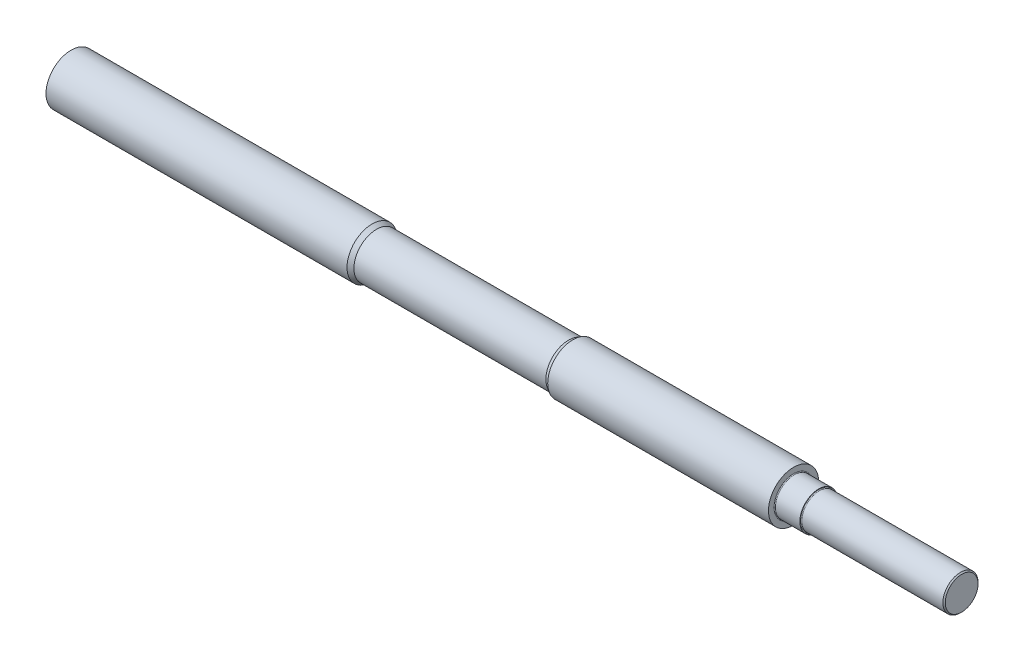
ISO-10303-21;
HEADER;
FILE_DESCRIPTION(('STEP AP214'),'2;1');
FILE_NAME('part.step','',(''),(''),'','','');
FILE_SCHEMA(('AUTOMOTIVE_DESIGN { 1 0 10303 214 1 1 1 1 }'));
ENDSEC;
DATA;
#1=APPLICATION_CONTEXT('core data for automotive mechanical design processes');
#2=APPLICATION_PROTOCOL_DEFINITION('international standard','automotive_design',2000,#1);
#3=PRODUCT_CONTEXT('',#1,'mechanical');
#4=PRODUCT('Part','Part','',(#3));
#5=PRODUCT_RELATED_PRODUCT_CATEGORY('part','',(#4));
#6=PRODUCT_DEFINITION_FORMATION('','',#4);
#7=PRODUCT_DEFINITION_CONTEXT('part definition',#1,'design');
#8=PRODUCT_DEFINITION('design','',#6,#7);
#9=PRODUCT_DEFINITION_SHAPE('','',#8);
#10=(LENGTH_UNIT() NAMED_UNIT(*) SI_UNIT(.MILLI.,.METRE.));
#11=(NAMED_UNIT(*) PLANE_ANGLE_UNIT() SI_UNIT($,.RADIAN.));
#12=(NAMED_UNIT(*) SI_UNIT($,.STERADIAN.) SOLID_ANGLE_UNIT());
#13=UNCERTAINTY_MEASURE_WITH_UNIT(LENGTH_MEASURE(1.E-05),#10,'distance_accuracy_value','');
#14=(GEOMETRIC_REPRESENTATION_CONTEXT(3) GLOBAL_UNCERTAINTY_ASSIGNED_CONTEXT((#13)) GLOBAL_UNIT_ASSIGNED_CONTEXT((#10,
#11,#12)) REPRESENTATION_CONTEXT('',''));
#15=CARTESIAN_POINT('',(0.,0.,0.));
#16=DIRECTION('',(0.,0.,1.));
#17=DIRECTION('',(1.,0.,0.));
#18=AXIS2_PLACEMENT_3D('',#15,#16,#17);
#19=CARTESIAN_POINT('',(0.,0.,0.));
#20=DIRECTION('',(1.,0.,0.));
#21=DIRECTION('',(0.,0.,-1.));
#22=AXIS2_PLACEMENT_3D('',#19,#20,#21);
#23=PLANE('',#22);
#24=CARTESIAN_POINT('',(0.,0.,0.));
#25=DIRECTION('',(-1.,0.,0.));
#26=DIRECTION('',(0.,0.,1.));
#27=AXIS2_PLACEMENT_3D('',#24,#25,#26);
#28=CIRCLE('',#27,10.);
#29=CARTESIAN_POINT('',(0.,0.,10.));
#30=VERTEX_POINT('',#29);
#31=EDGE_CURVE('E126',#30,#30,#28,.T.);
#32=ORIENTED_EDGE('',*,*,#31,.T.);
#33=EDGE_LOOP('',(#32));
#34=FACE_BOUND('',#33,.T.);
#35=CARTESIAN_POINT('',(0.,0.,0.));
#36=DIRECTION('',(-1.,0.,0.));
#37=DIRECTION('',(0.,0.,1.));
#38=AXIS2_PLACEMENT_3D('',#35,#36,#37);
#39=CIRCLE('',#38,5.);
#40=CARTESIAN_POINT('',(0.,0.,5.));
#41=VERTEX_POINT('',#40);
#42=EDGE_CURVE('E144',#41,#41,#39,.T.);
#43=ORIENTED_EDGE('',*,*,#42,.F.);
#44=EDGE_LOOP('',(#43));
#45=FACE_BOUND('',#44,.T.);
#46=ADVANCED_FACE('F44',(#34,#45),#23,.F.);
#47=CARTESIAN_POINT('',(355.,6.53333333333333,0.));
#48=DIRECTION('',(-1.,0.,0.));
#49=DIRECTION('',(0.,0.,1.));
#50=AXIS2_PLACEMENT_3D('',#47,#48,#49);
#51=PLANE('',#50);
#52=CARTESIAN_POINT('',(355.,0.,0.));
#53=DIRECTION('',(-1.,0.,0.));
#54=DIRECTION('',(0.,0.,1.));
#55=AXIS2_PLACEMENT_3D('',#52,#53,#54);
#56=CIRCLE('',#55,6.53333333333333);
#57=CARTESIAN_POINT('',(355.,0.,6.53333333333333));
#58=VERTEX_POINT('',#57);
#59=EDGE_CURVE('E11',#58,#58,#56,.T.);
#60=ORIENTED_EDGE('',*,*,#59,.F.);
#61=EDGE_LOOP('',(#60));
#62=FACE_BOUND('',#61,.T.);
#63=ADVANCED_FACE('F50',(#62),#51,.F.);
#64=CARTESIAN_POINT('',(355.,0.,0.));
#65=DIRECTION('',(-1.,0.,0.));
#66=DIRECTION('',(0.,0.,1.));
#67=AXIS2_PLACEMENT_3D('',#64,#65,#66);
#68=CONICAL_SURFACE('',#67,6.53333333333333,0.785398163397503);
#69=CARTESIAN_POINT('',(354.533333333333,0.,0.));
#70=DIRECTION('',(-1.,0.,0.));
#71=DIRECTION('',(0.,0.,1.));
#72=AXIS2_PLACEMENT_3D('',#69,#70,#71);
#73=CIRCLE('',#72,7.);
#74=CARTESIAN_POINT('',(354.533333333333,0.,7.));
#75=VERTEX_POINT('',#74);
#76=EDGE_CURVE('E55',#75,#75,#73,.T.);
#77=ORIENTED_EDGE('',*,*,#76,.F.);
#78=EDGE_LOOP('',(#77));
#79=FACE_BOUND('',#78,.T.);
#80=ORIENTED_EDGE('',*,*,#59,.T.);
#81=EDGE_LOOP('',(#80));
#82=FACE_BOUND('',#81,.T.);
#83=ADVANCED_FACE('F73',(#79,#82),#68,.T.);
#84=CARTESIAN_POINT('',(355.,0.,0.));
#85=DIRECTION('',(-1.,0.,0.));
#86=DIRECTION('',(0.,0.,1.));
#87=AXIS2_PLACEMENT_3D('',#84,#85,#86);
#88=CYLINDRICAL_SURFACE('',#87,6.99999999999999);
#89=CARTESIAN_POINT('',(298.3,0.,0.));
#90=DIRECTION('',(-1.,0.,0.));
#91=DIRECTION('',(0.,0.,1.));
#92=AXIS2_PLACEMENT_3D('',#89,#90,#91);
#93=CIRCLE('',#92,6.99999999999998);
#94=CARTESIAN_POINT('',(298.3,0.,6.99999999999998));
#95=VERTEX_POINT('',#94);
#96=EDGE_CURVE('E115',#95,#95,#93,.T.);
#97=ORIENTED_EDGE('',*,*,#96,.F.);
#98=EDGE_LOOP('',(#97));
#99=FACE_BOUND('',#98,.T.);
#100=ORIENTED_EDGE('',*,*,#76,.T.);
#101=EDGE_LOOP('',(#100));
#102=FACE_BOUND('',#101,.T.);
#103=ADVANCED_FACE('F100',(#99,#102),#88,.T.);
#104=CARTESIAN_POINT('',(298.3,0.,0.));
#105=DIRECTION('',(-1.,0.,0.));
#106=DIRECTION('',(0.,0.,1.));
#107=AXIS2_PLACEMENT_3D('',#104,#105,#106);
#108=TOROIDAL_SURFACE('',#107,7.29999999999999,0.300000000000005);
#109=CARTESIAN_POINT('',(298.,0.,0.));
#110=DIRECTION('',(-1.,0.,0.));
#111=DIRECTION('',(0.,0.,1.));
#112=AXIS2_PLACEMENT_3D('',#109,#110,#111);
#113=CIRCLE('',#112,7.3);
#114=CARTESIAN_POINT('',(298.,0.,7.3));
#115=VERTEX_POINT('',#114);
#116=EDGE_CURVE('E111',#115,#115,#113,.T.);
#117=ORIENTED_EDGE('',*,*,#116,.F.);
#118=EDGE_LOOP('',(#117));
#119=FACE_BOUND('',#118,.T.);
#120=ORIENTED_EDGE('',*,*,#96,.T.);
#121=EDGE_LOOP('',(#120));
#122=FACE_BOUND('',#121,.T.);
#123=ADVANCED_FACE('F94',(#119,#122),#108,.F.);
#124=CARTESIAN_POINT('',(298.,7.5,0.));
#125=DIRECTION('',(-1.,0.,0.));
#126=DIRECTION('',(0.,0.,1.));
#127=AXIS2_PLACEMENT_3D('',#124,#125,#126);
#128=PLANE('',#127);
#129=CARTESIAN_POINT('',(298.,0.,0.));
#130=DIRECTION('',(-1.,0.,0.));
#131=DIRECTION('',(0.,0.,1.));
#132=AXIS2_PLACEMENT_3D('',#129,#130,#131);
#133=CIRCLE('',#132,7.5);
#134=CARTESIAN_POINT('',(298.,0.,7.5));
#135=VERTEX_POINT('',#134);
#136=EDGE_CURVE('E118',#135,#135,#133,.T.);
#137=ORIENTED_EDGE('',*,*,#136,.F.);
#138=EDGE_LOOP('',(#137));
#139=FACE_BOUND('',#138,.T.);
#140=ORIENTED_EDGE('',*,*,#116,.T.);
#141=EDGE_LOOP('',(#140));
#142=FACE_BOUND('',#141,.T.);
#143=ADVANCED_FACE('F89',(#139,#142),#128,.F.);
#144=CARTESIAN_POINT('',(355.,0.,0.));
#145=DIRECTION('',(-1.,0.,0.));
#146=DIRECTION('',(0.,0.,1.));
#147=AXIS2_PLACEMENT_3D('',#144,#145,#146);
#148=CYLINDRICAL_SURFACE('',#147,7.5);
#149=CARTESIAN_POINT('',(288.3,0.,0.));
#150=DIRECTION('',(-1.,0.,0.));
#151=DIRECTION('',(0.,0.,1.));
#152=AXIS2_PLACEMENT_3D('',#149,#150,#151);
#153=CIRCLE('',#152,7.49999999999999);
#154=CARTESIAN_POINT('',(288.3,0.,7.49999999999999));
#155=VERTEX_POINT('',#154);
#156=EDGE_CURVE('E125',#155,#155,#153,.T.);
#157=ORIENTED_EDGE('',*,*,#156,.F.);
#158=EDGE_LOOP('',(#157));
#159=FACE_BOUND('',#158,.T.);
#160=ORIENTED_EDGE('',*,*,#136,.T.);
#161=EDGE_LOOP('',(#160));
#162=FACE_BOUND('',#161,.T.);
#163=ADVANCED_FACE('F88',(#159,#162),#148,.T.);
#164=CARTESIAN_POINT('',(288.3,0.,0.));
#165=DIRECTION('',(-1.,0.,0.));
#166=DIRECTION('',(0.,0.,1.));
#167=AXIS2_PLACEMENT_3D('',#164,#165,#166);
#168=TOROIDAL_SURFACE('',#167,7.79999999999989,0.299999999999903);
#169=CARTESIAN_POINT('',(288.,0.,0.));
#170=DIRECTION('',(-1.,0.,0.));
#171=DIRECTION('',(0.,0.,1.));
#172=AXIS2_PLACEMENT_3D('',#169,#170,#171);
#173=CIRCLE('',#172,7.8);
#174=CARTESIAN_POINT('',(288.,0.,7.8));
#175=VERTEX_POINT('',#174);
#176=EDGE_CURVE('E122',#175,#175,#173,.T.);
#177=ORIENTED_EDGE('',*,*,#176,.F.);
#178=EDGE_LOOP('',(#177));
#179=FACE_BOUND('',#178,.T.);
#180=ORIENTED_EDGE('',*,*,#156,.T.);
#181=EDGE_LOOP('',(#180));
#182=FACE_BOUND('',#181,.T.);
#183=ADVANCED_FACE('F81',(#179,#182),#168,.F.);
#184=CARTESIAN_POINT('',(288.,0.,0.));
#185=DIRECTION('',(-1.,0.,0.));
#186=DIRECTION('',(0.,0.,1.));
#187=AXIS2_PLACEMENT_3D('',#184,#185,#186);
#188=CYLINDRICAL_SURFACE('',#187,10.);
#189=ORIENTED_EDGE('',*,*,#31,.F.);
#190=EDGE_LOOP('',(#189));
#191=FACE_BOUND('',#190,.T.);
#192=CARTESIAN_POINT('',(120.,0.,0.));
#193=DIRECTION('',(-1.,0.,0.));
#194=DIRECTION('',(0.,0.,1.));
#195=AXIS2_PLACEMENT_3D('',#192,#193,#194);
#196=CIRCLE('',#195,10.);
#197=CARTESIAN_POINT('',(120.,0.,10.));
#198=VERTEX_POINT('',#197);
#199=EDGE_CURVE('E128',#198,#198,#196,.T.);
#200=ORIENTED_EDGE('',*,*,#199,.T.);
#201=EDGE_LOOP('',(#200));
#202=FACE_BOUND('',#201,.T.);
#203=ADVANCED_FACE('F83',(#191,#202),#188,.T.);
#204=CARTESIAN_POINT('',(121.732050807569,0.,0.));
#205=DIRECTION('',(-1.,0.,0.));
#206=DIRECTION('',(0.,0.,1.));
#207=AXIS2_PLACEMENT_3D('',#204,#205,#206);
#208=CONICAL_SURFACE('',#207,9.,0.523598775598296);
#209=ORIENTED_EDGE('',*,*,#199,.F.);
#210=EDGE_LOOP('',(#209));
#211=FACE_BOUND('',#210,.T.);
#212=CARTESIAN_POINT('',(121.732050807569,0.,0.));
#213=DIRECTION('',(-1.,0.,0.));
#214=DIRECTION('',(0.,0.,1.));
#215=AXIS2_PLACEMENT_3D('',#212,#213,#214);
#216=CIRCLE('',#215,9.);
#217=CARTESIAN_POINT('',(121.732050807569,0.,9.));
#218=VERTEX_POINT('',#217);
#219=EDGE_CURVE('E134',#218,#218,#216,.T.);
#220=ORIENTED_EDGE('',*,*,#219,.T.);
#221=EDGE_LOOP('',(#220));
#222=FACE_BOUND('',#221,.T.);
#223=ADVANCED_FACE('F173',(#211,#222),#208,.T.);
#224=CARTESIAN_POINT('',(288.,0.,0.));
#225=DIRECTION('',(-1.,0.,0.));
#226=DIRECTION('',(0.,0.,1.));
#227=AXIS2_PLACEMENT_3D('',#224,#225,#226);
#228=CYLINDRICAL_SURFACE('',#227,9.);
#229=ORIENTED_EDGE('',*,*,#219,.F.);
#230=EDGE_LOOP('',(#229));
#231=FACE_BOUND('',#230,.T.);
#232=CARTESIAN_POINT('',(198.267949192431,0.,0.));
#233=DIRECTION('',(-1.,0.,0.));
#234=DIRECTION('',(0.,0.,1.));
#235=AXIS2_PLACEMENT_3D('',#232,#233,#234);
#236=CIRCLE('',#235,9.);
#237=CARTESIAN_POINT('',(198.267949192431,0.,9.));
#238=VERTEX_POINT('',#237);
#239=EDGE_CURVE('E138',#238,#238,#236,.T.);
#240=ORIENTED_EDGE('',*,*,#239,.T.);
#241=EDGE_LOOP('',(#240));
#242=FACE_BOUND('',#241,.T.);
#243=ADVANCED_FACE('F171',(#231,#242),#228,.T.);
#244=CARTESIAN_POINT('',(200.,0.,0.));
#245=DIRECTION('',(1.,0.,0.));
#246=DIRECTION('',(0.,0.,-1.));
#247=AXIS2_PLACEMENT_3D('',#244,#245,#246);
#248=CONICAL_SURFACE('',#247,10.,0.523598775598296);
#249=ORIENTED_EDGE('',*,*,#239,.F.);
#250=EDGE_LOOP('',(#249));
#251=FACE_BOUND('',#250,.T.);
#252=CARTESIAN_POINT('',(200.,0.,0.));
#253=DIRECTION('',(-1.,0.,0.));
#254=DIRECTION('',(0.,0.,1.));
#255=AXIS2_PLACEMENT_3D('',#252,#253,#254);
#256=CIRCLE('',#255,10.);
#257=CARTESIAN_POINT('',(200.,0.,10.));
#258=VERTEX_POINT('',#257);
#259=EDGE_CURVE('E139',#258,#258,#256,.T.);
#260=ORIENTED_EDGE('',*,*,#259,.T.);
#261=EDGE_LOOP('',(#260));
#262=FACE_BOUND('',#261,.T.);
#263=ADVANCED_FACE('F169',(#251,#262),#248,.T.);
#264=CARTESIAN_POINT('',(288.,0.,0.));
#265=DIRECTION('',(-1.,0.,0.));
#266=DIRECTION('',(0.,0.,1.));
#267=AXIS2_PLACEMENT_3D('',#264,#265,#266);
#268=CYLINDRICAL_SURFACE('',#267,10.);
#269=ORIENTED_EDGE('',*,*,#259,.F.);
#270=EDGE_LOOP('',(#269));
#271=FACE_BOUND('',#270,.T.);
#272=CARTESIAN_POINT('',(288.,0.,0.));
#273=DIRECTION('',(-1.,0.,0.));
#274=DIRECTION('',(0.,0.,1.));
#275=AXIS2_PLACEMENT_3D('',#272,#273,#274);
#276=CIRCLE('',#275,10.);
#277=CARTESIAN_POINT('',(288.,0.,10.));
#278=VERTEX_POINT('',#277);
#279=EDGE_CURVE('E142',#278,#278,#276,.T.);
#280=ORIENTED_EDGE('',*,*,#279,.T.);
#281=EDGE_LOOP('',(#280));
#282=FACE_BOUND('',#281,.T.);
#283=ADVANCED_FACE('F165',(#271,#282),#268,.T.);
#284=CARTESIAN_POINT('',(288.,10.,0.));
#285=DIRECTION('',(-1.,0.,0.));
#286=DIRECTION('',(0.,0.,1.));
#287=AXIS2_PLACEMENT_3D('',#284,#285,#286);
#288=PLANE('',#287);
#289=ORIENTED_EDGE('',*,*,#176,.T.);
#290=EDGE_LOOP('',(#289));
#291=FACE_BOUND('',#290,.T.);
#292=ORIENTED_EDGE('',*,*,#279,.F.);
#293=EDGE_LOOP('',(#292));
#294=FACE_BOUND('',#293,.T.);
#295=ADVANCED_FACE('F156',(#291,#294),#288,.F.);
#296=CARTESIAN_POINT('',(0.812,0.,0.));
#297=DIRECTION('',(-1.,0.,0.));
#298=DIRECTION('',(0.,0.,1.));
#299=AXIS2_PLACEMENT_3D('',#296,#297,#298);
#300=CONICAL_SURFACE('',#299,4.188,0.785398163397448);
#301=ORIENTED_EDGE('',*,*,#42,.T.);
#302=EDGE_LOOP('',(#301));
#303=FACE_BOUND('',#302,.T.);
#304=CARTESIAN_POINT('',(0.812,0.,0.));
#305=DIRECTION('',(-1.,0.,0.));
#306=DIRECTION('',(0.,0.,1.));
#307=AXIS2_PLACEMENT_3D('',#304,#305,#306);
#308=CIRCLE('',#307,4.188);
#309=CARTESIAN_POINT('',(0.812,0.,4.188));
#310=VERTEX_POINT('',#309);
#311=EDGE_CURVE('E146',#310,#310,#308,.T.);
#312=ORIENTED_EDGE('',*,*,#311,.F.);
#313=EDGE_LOOP('',(#312));
#314=FACE_BOUND('',#313,.T.);
#315=ADVANCED_FACE('F65',(#303,#314),#300,.F.);
#316=CARTESIAN_POINT('',(26.4179429273662,0.,0.));
#317=DIRECTION('',(-1.,0.,0.));
#318=DIRECTION('',(0.,0.,1.));
#319=AXIS2_PLACEMENT_3D('',#316,#317,#318);
#320=CYLINDRICAL_SURFACE('',#319,4.188);
#321=ORIENTED_EDGE('',*,*,#311,.T.);
#322=EDGE_LOOP('',(#321));
#323=FACE_BOUND('',#322,.T.);
#324=CARTESIAN_POINT('',(24.,0.,0.));
#325=DIRECTION('',(-1.,0.,0.));
#326=DIRECTION('',(0.,0.,1.));
#327=AXIS2_PLACEMENT_3D('',#324,#325,#326);
#328=CIRCLE('',#327,4.188);
#329=CARTESIAN_POINT('',(24.,0.,4.188));
#330=VERTEX_POINT('',#329);
#331=EDGE_CURVE('E151',#330,#330,#328,.T.);
#332=ORIENTED_EDGE('',*,*,#331,.F.);
#333=EDGE_LOOP('',(#332));
#334=FACE_BOUND('',#333,.T.);
#335=ADVANCED_FACE('F60',(#323,#334),#320,.F.);
#336=CARTESIAN_POINT('',(26.4179429273662,0.,0.));
#337=DIRECTION('',(-1.,0.,0.));
#338=DIRECTION('',(0.,0.,1.));
#339=AXIS2_PLACEMENT_3D('',#336,#337,#338);
#340=CONICAL_SURFACE('',#339,0.,1.0471975511966);
#341=ORIENTED_EDGE('',*,*,#331,.T.);
#342=EDGE_LOOP('',(#341));
#343=FACE_BOUND('',#342,.T.);
#344=CARTESIAN_POINT('',(26.4179429273662,0.,0.));
#345=VERTEX_POINT('',#344);
#346=VERTEX_LOOP('',#345);
#347=FACE_BOUND('',#346,.T.);
#348=ADVANCED_FACE('F54',(#343,#347),#340,.F.);
#349=CLOSED_SHELL('',(#46,#63,#83,#103,#123,#143,#163,#183,#203,#223,#243,#263,#283,#295,#315,
#335,#348));
#350=MANIFOLD_SOLID_BREP('B2',#349);
#351=ADVANCED_BREP_SHAPE_REPRESENTATION('',(#18,#350),#14);
#352=SHAPE_DEFINITION_REPRESENTATION(#9,#351);
ENDSEC;
END-ISO-10303-21;
